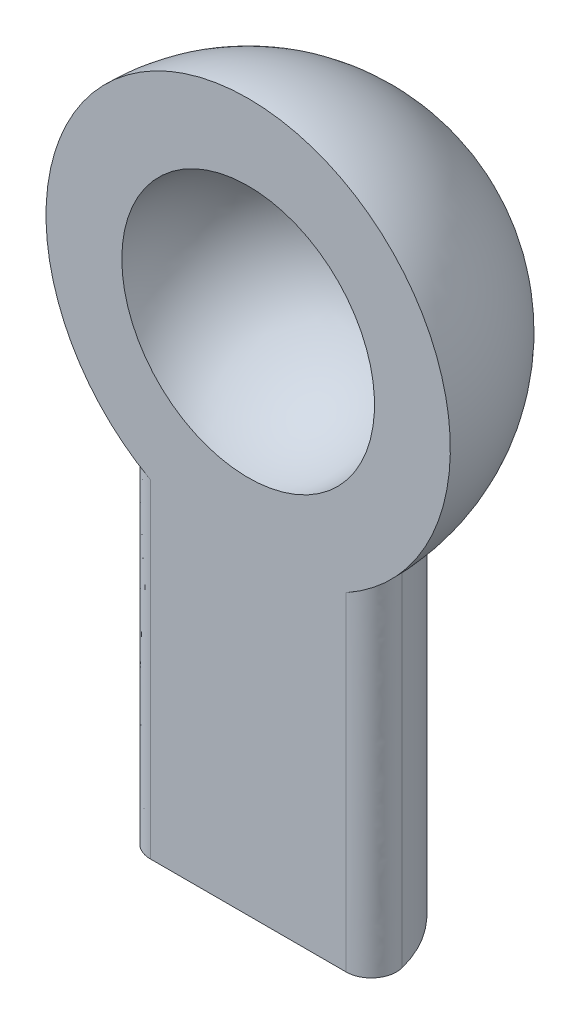
ISO-10303-21;
HEADER;
FILE_DESCRIPTION(('STEP AP214'),'2;1');
FILE_NAME('part.step','',(''),(''),'','','');
FILE_SCHEMA(('AUTOMOTIVE_DESIGN { 1 0 10303 214 1 1 1 1 }'));
ENDSEC;
DATA;
#1=APPLICATION_CONTEXT('core data for automotive mechanical design processes');
#2=APPLICATION_PROTOCOL_DEFINITION('international standard','automotive_design',2000,#1);
#3=PRODUCT_CONTEXT('',#1,'mechanical');
#4=PRODUCT('Part','Part','',(#3));
#5=PRODUCT_RELATED_PRODUCT_CATEGORY('part','',(#4));
#6=PRODUCT_DEFINITION_FORMATION('','',#4);
#7=PRODUCT_DEFINITION_CONTEXT('part definition',#1,'design');
#8=PRODUCT_DEFINITION('design','',#6,#7);
#9=PRODUCT_DEFINITION_SHAPE('','',#8);
#10=(LENGTH_UNIT() NAMED_UNIT(*) SI_UNIT(.MILLI.,.METRE.));
#11=(NAMED_UNIT(*) PLANE_ANGLE_UNIT() SI_UNIT($,.RADIAN.));
#12=(NAMED_UNIT(*) SI_UNIT($,.STERADIAN.) SOLID_ANGLE_UNIT());
#13=UNCERTAINTY_MEASURE_WITH_UNIT(LENGTH_MEASURE(1.E-05),#10,'distance_accuracy_value','');
#14=(GEOMETRIC_REPRESENTATION_CONTEXT(3) GLOBAL_UNCERTAINTY_ASSIGNED_CONTEXT((#13)) GLOBAL_UNIT_ASSIGNED_CONTEXT((#10,
#11,#12)) REPRESENTATION_CONTEXT('',''));
#15=CARTESIAN_POINT('',(0.,0.,0.));
#16=DIRECTION('',(0.,0.,1.));
#17=DIRECTION('',(1.,0.,0.));
#18=AXIS2_PLACEMENT_3D('',#15,#16,#17);
#19=CARTESIAN_POINT('',(0.,20.,0.));
#20=DIRECTION('',(0.,1.,0.));
#21=DIRECTION('',(-1.,0.,0.));
#22=AXIS2_PLACEMENT_3D('',#19,#20,#21);
#23=SPHERICAL_SURFACE('',#22,8.);
#24=CARTESIAN_POINT('',(0.,20.,0.));
#25=DIRECTION('',(0.,0.,-1.));
#26=DIRECTION('',(-1.,0.,0.));
#27=AXIS2_PLACEMENT_3D('',#24,#25,#26);
#28=CIRCLE('',#27,8.);
#29=CARTESIAN_POINT('',(-3.87298334620742,13.,0.));
#30=VERTEX_POINT('',#29);
#31=CARTESIAN_POINT('',(3.87298334620742,13.,0.));
#32=VERTEX_POINT('',#31);
#33=EDGE_CURVE('E103',#30,#32,#28,.T.);
#34=ORIENTED_EDGE('',*,*,#33,.T.);
#35=CARTESIAN_POINT('',(4.84122918275928,13.7550020016016,-1.24999999999997));
#36=CARTESIAN_POINT('',(4.84517449890082,13.7550017311124,-1.23472304321127));
#37=CARTESIAN_POINT('',(4.84875654363456,13.7547449194656,-1.21935310364537));
#38=CARTESIAN_POINT('',(4.85523204713585,13.7537310214066,-1.18826225589893));
#39=CARTESIAN_POINT('',(4.85811526435,13.7529670444844,-1.17253943677382));
#40=CARTESIAN_POINT('',(4.86315512987115,13.7509389497295,-1.14079000036561));
#41=CARTESIAN_POINT('',(4.86530136511618,13.7496681722117,-1.12476215928097));
#42=CARTESIAN_POINT('',(4.86883460976708,13.7466261548325,-1.0924542051));
#43=CARTESIAN_POINT('',(4.87021120919986,13.7448485221446,-1.07617355768935));
#44=CARTESIAN_POINT('',(4.87217688786771,13.7407925418353,-1.04341581706418));
#45=CARTESIAN_POINT('',(4.87275570488137,13.7385081004282,-1.02693886513861));
#46=CARTESIAN_POINT('',(4.87310297131638,13.7334381983167,-0.993847992774373));
#47=CARTESIAN_POINT('',(4.87286144508361,13.7306469635631,-0.977234854719974));
#48=CARTESIAN_POINT('',(4.87155107096679,13.7245631272731,-0.943934142065381));
#49=CARTESIAN_POINT('',(4.87047265526597,13.7212650836719,-0.927247940746631));
#50=CARTESIAN_POINT('',(4.86747791032664,13.7141673842342,-0.89386583201153));
#51=CARTESIAN_POINT('',(4.86555252307083,13.7103626247713,-0.877171824350381));
#52=CARTESIAN_POINT('',(4.8608600680814,13.7022507990612,-0.843840591073587));
#53=CARTESIAN_POINT('',(4.85808453347693,13.6979389617359,-0.827205722292755));
#54=CARTESIAN_POINT('',(4.85169461511282,13.6888139686373,-0.794058667739872));
#55=CARTESIAN_POINT('',(4.84807240927266,13.6839963843107,-0.777549206837306));
#56=CARTESIAN_POINT('',(4.8407653536439,13.6748156546857,-0.747833804420158));
#57=CARTESIAN_POINT('',(4.83721108705677,13.6705286271524,-0.734571917666171));
#58=CARTESIAN_POINT('',(4.82945406565619,13.6615165078695,-0.707828175143651));
#59=CARTESIAN_POINT('',(4.82523284555334,13.656781293593,-0.694355084642807));
#60=CARTESIAN_POINT('',(4.81610417482224,13.6468734353512,-0.667231607508277));
#61=CARTESIAN_POINT('',(4.81117819626278,13.6416913708853,-0.653590908815445));
#62=CARTESIAN_POINT('',(4.80060492791395,13.6308888259854,-0.6261804675787));
#63=CARTESIAN_POINT('',(4.79493919907934,13.6252595210524,-0.612421321630378));
#64=CARTESIAN_POINT('',(4.78285474235883,13.6135620263706,-0.584827688781449));
#65=CARTESIAN_POINT('',(4.77641781865232,13.6074855768217,-0.571004678888845));
#66=CARTESIAN_POINT('',(4.76276357004897,13.5948932304468,-0.543342303896936));
#67=CARTESIAN_POINT('',(4.75552845197282,13.5883695868553,-0.529515253887322));
#68=CARTESIAN_POINT('',(4.74025557326106,13.5748823990728,-0.501908726160739));
#69=CARTESIAN_POINT('',(4.73220058247628,13.5679115780576,-0.488142341728638));
#70=CARTESIAN_POINT('',(4.71527175236384,13.5535295054246,-0.460725534008017));
#71=CARTESIAN_POINT('',(4.70638140386347,13.5461114014188,-0.447088903544578));
#72=CARTESIAN_POINT('',(4.68777252438137,13.5308346921881,-0.420003766622003));
#73=CARTESIAN_POINT('',(4.67803835639875,13.5229696320898,-0.406569653127276));
#74=CARTESIAN_POINT('',(4.65774012447701,13.5067973465515,-0.379964795188951));
#75=CARTESIAN_POINT('',(4.64716143498882,13.4984839881344,-0.366808928255593));
#76=CARTESIAN_POINT('',(4.62793558529907,13.483558410808,-0.344092405931866));
#77=CARTESIAN_POINT('',(4.61940420748544,13.4769950113722,-0.334401150114037));
#78=CARTESIAN_POINT('',(4.60134917065085,13.4632469652882,-0.314671318671945));
#79=CARTESIAN_POINT('',(4.59179952039887,13.456053192288,-0.304662854347321));
#80=CARTESIAN_POINT('',(4.57165551558681,13.441042929965,-0.284405633045298));
#81=CARTESIAN_POINT('',(4.5610348536747,13.433218137639,-0.274189210649754));
#82=CARTESIAN_POINT('',(4.53870389739684,13.4169445811371,-0.25363481302909));
#83=CARTESIAN_POINT('',(4.5269674621031,13.4084880628905,-0.24333131088492));
#84=CARTESIAN_POINT('',(4.50878461697381,13.39552490143,-0.228104312534543));
#85=CARTESIAN_POINT('',(4.50248951042612,13.3910612451123,-0.222962113511322));
#86=CARTESIAN_POINT('',(4.48961373932205,13.3819746062639,-0.212702969386924));
#87=CARTESIAN_POINT('',(4.48303000780728,13.3773506529993,-0.207590731305967));
#88=CARTESIAN_POINT('',(4.46467665735069,13.3645389154318,-0.193703089960642));
#89=CARTESIAN_POINT('',(4.45278549817613,13.3563256086702,-0.185110961628013));
#90=CARTESIAN_POINT('',(4.42871773885719,13.3398747500577,-0.1685121798249));
#91=CARTESIAN_POINT('',(4.41654259280055,13.3316374559965,-0.160503158684071));
#92=CARTESIAN_POINT('',(4.39195120573381,13.3151314088798,-0.145083623340017));
#93=CARTESIAN_POINT('',(4.37953646662707,13.3068630165597,-0.1376703281985));
#94=CARTESIAN_POINT('',(4.35450407925143,13.2903015076084,-0.123447827579036));
#95=CARTESIAN_POINT('',(4.34188796004092,13.282008789911,-0.116635466439459));
#96=CARTESIAN_POINT('',(4.31650509682454,13.2653785656041,-0.10362350339597));
#97=CARTESIAN_POINT('',(4.30373977511997,13.2570416571234,-0.0974203582960616));
#98=CARTESIAN_POINT('',(4.27569767602682,13.2388644184053,-0.0845222273847646));
#99=CARTESIAN_POINT('',(4.26037539253841,13.2290185179265,-0.0779337564544241));
#100=CARTESIAN_POINT('',(4.22989139781612,13.2096887112524,-0.065720998394572));
#101=CARTESIAN_POINT('',(4.21474028849054,13.2002033198753,-0.0600725708280443));
#102=CARTESIAN_POINT('',(4.1846763776472,13.1815710679745,-0.0496884468560876));
#103=CARTESIAN_POINT('',(4.16977237755337,13.1724234283698,-0.0449286645399846));
#104=CARTESIAN_POINT('',(4.14025548531907,13.1544727561987,-0.0362604306973374));
#105=CARTESIAN_POINT('',(4.12565016383195,13.1456686739409,-0.0323283631249993));
#106=CARTESIAN_POINT('',(4.0967782990582,13.1284037050425,-0.0252544657546566));
#107=CARTESIAN_POINT('',(4.08251806777386,13.1199417029849,-0.0220895876168185));
#108=CARTESIAN_POINT('',(4.05437453211108,13.1033614467758,-0.016488168512126));
#109=CARTESIAN_POINT('',(4.04049643121136,13.0952419041192,-0.0140292873102553));
#110=CARTESIAN_POINT('',(4.01314770755768,13.0793466544179,-0.00977870084662752));
#111=CARTESIAN_POINT('',(3.99968129524523,13.0715694610967,-0.00796545352250233));
#112=CARTESIAN_POINT('',(3.97317926429902,13.0563592260841,-0.00494636358432231));
#113=CARTESIAN_POINT('',(3.96014699439738,13.0489244512521,-0.00371984389603224));
#114=CARTESIAN_POINT('',(3.93453026464198,13.0343991536632,-0.00181646041836933));
#115=CARTESIAN_POINT('',(3.92194841502806,13.0273066184958,-0.00111982607227008));
#116=CARTESIAN_POINT('',(3.89724355976341,13.0134667390964,-0.00022104334507246));
#117=CARTESIAN_POINT('',(3.88512256169745,13.0067170290987,-4.74547891261816E-08));
#118=CARTESIAN_POINT('',(3.87298334620742,13.,0.));
#119=B_SPLINE_CURVE_WITH_KNOTS('',3,(#35,#36,#37,#38,#39,#40,#41,#42,#43,#44,#45,#46,#47,#48,
#49,#50,#51,#52,#53,#54,#55,#56,#57,#58,#59,#60,#61,#62,#63,#64,#65,#66,#67,#68,#69,#70,#71,#72,
#73,#74,#75,#76,#77,#78,#79,#80,#81,#82,#83,#84,#85,#86,#87,#88,#89,#90,#91,#92,#93,#94,#95,#96,
#97,#98,#99,#100,#101,#102,#103,#104,#105,#106,#107,#108,#109,#110,#111,#112,#113,#114,#115,
#116,#117,#118),.UNSPECIFIED.,.F.,.F.,(4,2,2,2,2,2,2,2,2,2,2,2,2,2,2,2,2,2,2,2,2,2,2,2,2,2,2,2,
2,2,2,2,2,2,2,2,2,2,2,2,2,4),(0.,0.0473269009181145,0.0953103318650914,0.143946244780643,
0.193225000092512,0.243131913094547,0.293647873138192,0.344750026438545,0.396412512000527,
0.448607238804515,0.501304691052283,0.544441775659025,0.589101880513792,0.635288929018718,
0.683000169395728,0.732226182141734,0.782950910869669,0.835151731996871,0.888799578553837,
0.943859132535205,1.00028909865444,1.04373207280588,1.0904971184631,1.14054028938377,
1.19380330184971,1.22162144274668,1.25021568274399,1.3006417154031,1.35085002904772,
1.40080840201201,1.45048650557079,1.49985604473511,1.55794171589092,1.61416509373185,
1.66852089753118,1.7210107188144,1.77164225352661,1.82042855265082,1.86738730886469,
1.91254019257861,1.95591224694478,1.99753134825783),.UNSPECIFIED.);
#120=CARTESIAN_POINT('',(4.84122918275928,13.7550020016016,-1.24999999999997));
#121=VERTEX_POINT('',#120);
#122=EDGE_CURVE('E62',#32,#121,#119,.F.);
#123=ORIENTED_EDGE('',*,*,#122,.T.);
#124=CARTESIAN_POINT('',(0.,13.7550020016016,0.));
#125=DIRECTION('',(0.,1.,0.));
#126=DIRECTION('',(0.,0.,1.));
#127=AXIS2_PLACEMENT_3D('',#124,#125,#126);
#128=CIRCLE('',#127,5.);
#129=CARTESIAN_POINT('',(-4.84122918275926,13.7550020016016,-1.25000000000004));
#130=VERTEX_POINT('',#129);
#131=EDGE_CURVE('E108',#121,#130,#128,.T.);
#132=ORIENTED_EDGE('',*,*,#131,.T.);
#133=CARTESIAN_POINT('',(-3.87298334620742,13.,0.));
#134=CARTESIAN_POINT('',(-3.88426025106492,13.0062407262947,-1.67253781501792E-07));
#135=CARTESIAN_POINT('',(-3.89551492857825,13.0125212550388,-0.000190764600319241));
#136=CARTESIAN_POINT('',(-3.91866874949761,13.0255336229444,-0.000972840308844891));
#137=CARTESIAN_POINT('',(-3.93056486389096,13.0322694216143,-0.0015883006689479));
#138=CARTESIAN_POINT('',(-3.95500403247071,13.0461919526013,-0.00328971833224226));
#139=CARTESIAN_POINT('',(-3.96754356575377,13.0533817152868,-0.00440143880014567));
#140=CARTESIAN_POINT('',(-3.99326510692608,13.0682133095032,-0.0071711820111923));
#141=CARTESIAN_POINT('',(-4.00644280538155,13.0758574608212,-0.00885683260048889));
#142=CARTESIAN_POINT('',(-4.03342884211371,13.0915983597749,-0.0128559249651868));
#143=CARTESIAN_POINT('',(-4.04723182569824,13.0996967925027,-0.0151988915533788));
#144=CARTESIAN_POINT('',(-4.07544737079602,13.116346872749,-0.0205994272111727));
#145=CARTESIAN_POINT('',(-4.08985323784097,13.1248996830792,-0.0236884134854208));
#146=CARTESIAN_POINT('',(-4.11924284398668,13.142458752875,-0.0306724269198329));
#147=CARTESIAN_POINT('',(-4.13421825346362,13.151465736397,-0.0346007087299618));
#148=CARTESIAN_POINT('',(-4.16470227432436,13.1699342587246,-0.0433580209263774));
#149=CARTESIAN_POINT('',(-4.18020058885494,13.1793962301055,-0.0482220113965249));
#150=CARTESIAN_POINT('',(-4.21167345636195,13.1987718630582,-0.0589482863375153));
#151=CARTESIAN_POINT('',(-4.22763553672593,13.2086855747938,-0.0648470829404727));
#152=CARTESIAN_POINT('',(-4.25995558520474,13.2289772044854,-0.0777370174510141));
#153=CARTESIAN_POINT('',(-4.27629826989982,13.2393556158258,-0.0847657759737007));
#154=CARTESIAN_POINT('',(-4.3053210792898,13.2579676923677,-0.0981767922414438));
#155=CARTESIAN_POINT('',(-4.31807041418941,13.2662084838121,-0.104400030255777));
#156=CARTESIAN_POINT('',(-4.34341664614532,13.282694196337,-0.117448551813905));
#157=CARTESIAN_POINT('',(-4.35601168332097,13.2909386850377,-0.124277999823056));
#158=CARTESIAN_POINT('',(-4.38100172896137,13.3074434134765,-0.13853277320315));
#159=CARTESIAN_POINT('',(-4.39339477529436,13.3157033740108,-0.1459618611524));
#160=CARTESIAN_POINT('',(-4.41794344722145,13.332230501762,-0.16141192231368));
#161=CARTESIAN_POINT('',(-4.43009713149134,13.3404973978677,-0.169436270594179));
#162=CARTESIAN_POINT('',(-4.45411550068943,13.357060657571,-0.186058883020255));
#163=CARTESIAN_POINT('',(-4.46597823315958,13.3653569338471,-0.194660055578425));
#164=CARTESIAN_POINT('',(-4.48928944126313,13.3818120882725,-0.212358104706828));
#165=CARTESIAN_POINT('',(-4.50073985922088,13.3899714748086,-0.221451947157858));
#166=CARTESIAN_POINT('',(-4.52326398771482,13.4060971402199,-0.240165449138631));
#167=CARTESIAN_POINT('',(-4.53433877244625,13.4140639469734,-0.249783359844338));
#168=CARTESIAN_POINT('',(-4.55606667370814,13.4298267945053,-0.269512605102582));
#169=CARTESIAN_POINT('',(-4.56672123613319,13.4376233702882,-0.279621919925294));
#170=CARTESIAN_POINT('',(-4.58757940244896,13.4530372347649,-0.300309243214533));
#171=CARTESIAN_POINT('',(-4.59778481690463,13.4606551714496,-0.310884942562751));
#172=CARTESIAN_POINT('',(-4.61771035650425,13.4757230866386,-0.332469912936396));
#173=CARTESIAN_POINT('',(-4.62743272704942,13.4831737320333,-0.343476646501922));
#174=CARTESIAN_POINT('',(-4.64781117964939,13.4989823001072,-0.367602969700455));
#175=CARTESIAN_POINT('',(-4.6583982440965,13.5073151328685,-0.380797510932248));
#176=CARTESIAN_POINT('',(-4.67871247063192,13.5235162517942,-0.407484338758797));
#177=CARTESIAN_POINT('',(-4.68845426960998,13.531390904745,-0.420961618404674));
#178=CARTESIAN_POINT('',(-4.70707408662026,13.5466869315113,-0.448133214516413));
#179=CARTESIAN_POINT('',(-4.71596784587205,13.5541147502905,-0.461813110481881));
#180=CARTESIAN_POINT('',(-4.73290009080225,13.5685137323381,-0.489317236800921));
#181=CARTESIAN_POINT('',(-4.74095517380934,13.5754918087148,-0.503127624545902));
#182=CARTESIAN_POINT('',(-4.75622465632869,13.588991666637,-0.530822298390799));
#183=CARTESIAN_POINT('',(-4.76345638619381,13.5955207710958,-0.544693454235875));
#184=CARTESIAN_POINT('',(-4.77710044499716,13.6081220188642,-0.57244390138242));
#185=CARTESIAN_POINT('',(-4.78353067005881,13.6142019637082,-0.586310845040741));
#186=CARTESIAN_POINT('',(-4.79559844687034,13.625904470833,-0.613991869799861));
#187=CARTESIAN_POINT('',(-4.80125430080806,13.6315353502684,-0.627794448919459));
#188=CARTESIAN_POINT('',(-4.81180471979255,13.6423390467633,-0.65529100497607));
#189=CARTESIAN_POINT('',(-4.81671783158434,13.647520750181,-0.668974367701695));
#190=CARTESIAN_POINT('',(-4.82581787076638,13.657425900391,-0.696182168642175));
#191=CARTESIAN_POINT('',(-4.83002343380571,13.662158833113,-0.709696909487885));
#192=CARTESIAN_POINT('',(-4.83774647023027,13.6711643531311,-0.736522765110263));
#193=CARTESIAN_POINT('',(-4.84128251488277,13.6754471339095,-0.749825112609563));
#194=CARTESIAN_POINT('',(-4.84851793605977,13.684581222159,-0.77951689023877));
#195=CARTESIAN_POINT('',(-4.85209143072192,13.6893590914305,-0.795959884443312));
#196=CARTESIAN_POINT('',(-4.85839136995357,13.6984089340294,-0.82897147508804));
#197=CARTESIAN_POINT('',(-4.86112551326247,13.7026852684548,-0.845537408770571));
#198=CARTESIAN_POINT('',(-4.86574275920894,13.7107303206039,-0.878729097482264));
#199=CARTESIAN_POINT('',(-4.86763419311863,13.7145037367921,-0.895352551146842));
#200=CARTESIAN_POINT('',(-4.87056862288463,13.7215430014228,-0.928592740426213));
#201=CARTESIAN_POINT('',(-4.87162053008263,13.7248138750156,-0.945207623210851));
#202=CARTESIAN_POINT('',(-4.87288537972933,13.7308476251218,-0.978365727635962));
#203=CARTESIAN_POINT('',(-4.87310773409543,13.7336158594352,-0.99490761280711));
#204=CARTESIAN_POINT('',(-4.87272940919051,13.7386440214056,-1.02785681161495));
#205=CARTESIAN_POINT('',(-4.87213854279332,13.7409096330849,-1.04426336816708));
#206=CARTESIAN_POINT('',(-4.87015574456906,13.7449322201413,-1.0768819004704));
#207=CARTESIAN_POINT('',(-4.86877390809269,13.7466951937688,-1.09309374767369));
#208=CARTESIAN_POINT('',(-4.86523677356043,13.7497121653615,-1.12526636886301));
#209=CARTESIAN_POINT('',(-4.86309171769566,13.7509724555433,-1.14122767670434));
#210=CARTESIAN_POINT('',(-4.85806033221032,13.752983851423,-1.17284692098074));
#211=CARTESIAN_POINT('',(-4.8551842502252,13.753741511856,-1.18850606745252));
#212=CARTESIAN_POINT('',(-4.84872859465613,13.7547470631326,-1.21947297489699));
#213=CARTESIAN_POINT('',(-4.84515910345998,13.7550017360304,-1.23478262001604));
#214=CARTESIAN_POINT('',(-4.84122918275926,13.7550020016016,-1.25000000000004));
#215=B_SPLINE_CURVE_WITH_KNOTS('',3,(#133,#134,#135,#136,#137,#138,#139,#140,#141,#142,#143,
#144,#145,#146,#147,#148,#149,#150,#151,#152,#153,#154,#155,#156,#157,#158,#159,#160,#161,#162,
#163,#164,#165,#166,#167,#168,#169,#170,#171,#172,#173,#174,#175,#176,#177,#178,#179,#180,#181,
#182,#183,#184,#185,#186,#187,#188,#189,#190,#191,#192,#193,#194,#195,#196,#197,#198,#199,#200,
#201,#202,#203,#204,#205,#206,#207,#208,#209,#210,#211,#212,#213,#214),.UNSPECIFIED.,.F.,.F.,(4,
2,2,2,2,2,2,2,2,2,2,2,2,2,2,2,2,2,2,2,2,2,2,2,2,2,2,2,2,2,2,2,2,2,2,2,2,2,2,2,4),(0.,
0.0386640133752304,0.079710852891266,0.123194553822648,0.169167258103765,0.217678382625703,
0.268773585218735,0.322493525803233,0.37887242522525,0.437936432404873,0.499701821785661,
0.54891174621694,0.598490665857484,0.648409326763502,0.69863658005431,0.7491395260828,
0.799360641665544,0.849423365532818,0.899295335367933,0.948943301701567,0.998333379939762,
1.05488483450386,1.11006326394377,1.16382718682616,1.2161411323529,1.26697591878709,
1.31630884969266,1.3641238409308,1.41041149294053,1.45516912369352,1.4984007779017,
1.55084864885298,1.60279999666041,1.65422567803792,1.70509794689116,1.75539124406085,
1.80508295974744,1.85415415574929,1.90259023593983,1.95038155473196,1.99752395453478),.UNSPECIFIED.);
#216=EDGE_CURVE('E11',#130,#30,#215,.F.);
#217=ORIENTED_EDGE('',*,*,#216,.T.);
#218=EDGE_LOOP('',(#34,#123,#132,#217));
#219=FACE_BOUND('',#218,.T.);
#220=ADVANCED_FACE('F48',(#219),#23,.T.);
#221=CARTESIAN_POINT('',(0.,0.,0.));
#222=DIRECTION('',(0.,1.,0.));
#223=DIRECTION('',(0.,0.,1.));
#224=AXIS2_PLACEMENT_3D('',#221,#222,#223);
#225=CYLINDRICAL_SURFACE('',#224,5.);
#226=ORIENTED_EDGE('',*,*,#131,.F.);
#227=CARTESIAN_POINT('',(4.84122918275928,-0.687750100080081,-1.24999999999997));
#228=CARTESIAN_POINT('',(4.84122918275928,4.35575063384051,-1.24999999999997));
#229=CARTESIAN_POINT('',(4.84122918275928,9.39925136776109,-1.24999999999997));
#230=CARTESIAN_POINT('',(4.84122918275928,14.4427521016817,-1.24999999999997));
#231=(BOUNDED_CURVE() B_SPLINE_CURVE(3,(#227,#228,#229,#230),.UNSPECIFIED.,.F.,
.F.) B_SPLINE_CURVE_WITH_KNOTS((4,4),(-0.000687750100080081,0.0144427521016817),
.UNSPECIFIED.) CURVE() GEOMETRIC_REPRESENTATION_ITEM() RATIONAL_B_SPLINE_CURVE((1.,1.,1.,1.)) REPRESENTATION_ITEM(''));
#232=CARTESIAN_POINT('',(4.84122918275928,0.,-1.24999999999997));
#233=VERTEX_POINT('',#232);
#234=EDGE_CURVE('E126',#121,#233,#231,.F.);
#235=ORIENTED_EDGE('',*,*,#234,.T.);
#236=CARTESIAN_POINT('',(0.,0.,0.));
#237=DIRECTION('',(0.,1.,0.));
#238=DIRECTION('',(0.,0.,1.));
#239=AXIS2_PLACEMENT_3D('',#236,#237,#238);
#240=CIRCLE('',#239,5.);
#241=CARTESIAN_POINT('',(-4.84122918275926,0.,-1.25000000000004));
#242=VERTEX_POINT('',#241);
#243=EDGE_CURVE('E166',#233,#242,#240,.T.);
#244=ORIENTED_EDGE('',*,*,#243,.T.);
#245=CARTESIAN_POINT('',(-4.84122918275926,14.4427521016817,-1.25000000000004));
#246=CARTESIAN_POINT('',(-4.84122918275926,9.39925136776109,-1.25000000000004));
#247=CARTESIAN_POINT('',(-4.84122918275926,4.35575063384051,-1.25000000000004));
#248=CARTESIAN_POINT('',(-4.84122918275926,-0.687750100080081,-1.25000000000004));
#249=(BOUNDED_CURVE() B_SPLINE_CURVE(3,(#245,#246,#247,#248),.UNSPECIFIED.,.F.,
.F.) B_SPLINE_CURVE_WITH_KNOTS((4,4),(-0.000687750100080081,0.0144427521016817),
.UNSPECIFIED.) CURVE() GEOMETRIC_REPRESENTATION_ITEM() RATIONAL_B_SPLINE_CURVE((1.,1.,1.,1.)) REPRESENTATION_ITEM(''));
#250=EDGE_CURVE('E123',#242,#130,#249,.F.);
#251=ORIENTED_EDGE('',*,*,#250,.T.);
#252=EDGE_LOOP('',(#226,#235,#244,#251));
#253=FACE_BOUND('',#252,.T.);
#254=ADVANCED_FACE('F186',(#253),#225,.T.);
#255=CARTESIAN_POINT('',(0.,0.,0.));
#256=DIRECTION('',(0.,1.,0.));
#257=DIRECTION('',(0.,0.,1.));
#258=AXIS2_PLACEMENT_3D('',#255,#256,#257);
#259=PLANE('',#258);
#260=ORIENTED_EDGE('',*,*,#243,.F.);
#261=CARTESIAN_POINT('',(3.87298334620742,0.,0.));
#262=CARTESIAN_POINT('',(5.16397779494322,0.,0.));
#263=CARTESIAN_POINT('',(4.84122918275928,0.,-1.24999999999997));
#264=(BOUNDED_CURVE() B_SPLINE_CURVE(2,(#261,#262,#263),.UNSPECIFIED.,.F.,
.F.) B_SPLINE_CURVE_WITH_KNOTS((3,3),(0.,1.),
.UNSPECIFIED.) CURVE() GEOMETRIC_REPRESENTATION_ITEM() RATIONAL_B_SPLINE_CURVE((1.,
0.612372435695795,1.)) REPRESENTATION_ITEM(''));
#265=CARTESIAN_POINT('',(3.87298334620742,0.,0.));
#266=VERTEX_POINT('',#265);
#267=EDGE_CURVE('E118',#233,#266,#264,.F.);
#268=ORIENTED_EDGE('',*,*,#267,.T.);
#269=DIRECTION('',(1.,0.,0.));
#270=VECTOR('',#269,1.);
#271=CARTESIAN_POINT('',(0.,0.,0.));
#272=LINE('',#271,#270);
#273=CARTESIAN_POINT('',(-3.87298334620742,0.,0.));
#274=VERTEX_POINT('',#273);
#275=EDGE_CURVE('E101',#274,#266,#272,.T.);
#276=ORIENTED_EDGE('',*,*,#275,.F.);
#277=CARTESIAN_POINT('',(-4.84122918275926,0.,-1.25000000000004));
#278=CARTESIAN_POINT('',(-5.16397779494323,0.,0.));
#279=CARTESIAN_POINT('',(-3.87298334620742,0.,0.));
#280=(BOUNDED_CURVE() B_SPLINE_CURVE(2,(#277,#278,#279),.UNSPECIFIED.,.F.,
.F.) B_SPLINE_CURVE_WITH_KNOTS((3,3),(0.,1.),
.UNSPECIFIED.) CURVE() GEOMETRIC_REPRESENTATION_ITEM() RATIONAL_B_SPLINE_CURVE((1.,
0.612372435695794,1.)) REPRESENTATION_ITEM(''));
#281=EDGE_CURVE('E114',#274,#242,#280,.F.);
#282=ORIENTED_EDGE('',*,*,#281,.T.);
#283=EDGE_LOOP('',(#260,#268,#276,#282));
#284=FACE_BOUND('',#283,.T.);
#285=ADVANCED_FACE('F113',(#284),#259,.F.);
#286=CARTESIAN_POINT('',(0.,20.,0.));
#287=DIRECTION('',(0.,1.,0.));
#288=DIRECTION('',(-1.,0.,0.));
#289=AXIS2_PLACEMENT_3D('',#286,#287,#288);
#290=SPHERICAL_SURFACE('',#289,5.);
#291=CARTESIAN_POINT('',(0.,20.,0.));
#292=DIRECTION('',(0.,0.,-1.));
#293=DIRECTION('',(-1.,0.,0.));
#294=AXIS2_PLACEMENT_3D('',#291,#292,#293);
#295=SPHERICAL_SURFACE('',#294,5.);
#296=CARTESIAN_POINT('',(0.,20.,0.));
#297=DIRECTION('',(0.,0.,-1.));
#298=DIRECTION('',(-1.,0.,0.));
#299=AXIS2_PLACEMENT_3D('',#296,#297,#298);
#300=CIRCLE('',#299,5.);
#301=CARTESIAN_POINT('',(-5.,20.,0.));
#302=VERTEX_POINT('',#301);
#303=EDGE_CURVE('E121',#302,#302,#300,.T.);
#304=ORIENTED_EDGE('',*,*,#303,.F.);
#305=EDGE_LOOP('',(#304));
#306=FACE_BOUND('',#305,.T.);
#307=ADVANCED_FACE('F177',(#306),#295,.F.);
#308=CARTESIAN_POINT('',(0.,0.,0.));
#309=DIRECTION('',(0.,0.,-1.));
#310=DIRECTION('',(-1.,0.,0.));
#311=AXIS2_PLACEMENT_3D('',#308,#309,#310);
#312=PLANE('',#311);
#313=ORIENTED_EDGE('',*,*,#303,.T.);
#314=EDGE_LOOP('',(#313));
#315=FACE_BOUND('',#314,.T.);
#316=ORIENTED_EDGE('',*,*,#275,.T.);
#317=CARTESIAN_POINT('',(3.87298334620742,14.4427521016817,0.));
#318=CARTESIAN_POINT('',(3.87298334620742,9.39925136776109,0.));
#319=CARTESIAN_POINT('',(3.87298334620742,4.35575063384051,0.));
#320=CARTESIAN_POINT('',(3.87298334620742,-0.687750100080081,0.));
#321=(BOUNDED_CURVE() B_SPLINE_CURVE(3,(#317,#318,#319,#320),.UNSPECIFIED.,.F.,
.F.) B_SPLINE_CURVE_WITH_KNOTS((4,4),(-0.000687750100080081,0.0144427521016817),
.UNSPECIFIED.) CURVE() GEOMETRIC_REPRESENTATION_ITEM() RATIONAL_B_SPLINE_CURVE((1.,1.,1.,1.)) REPRESENTATION_ITEM(''));
#322=EDGE_CURVE('E107',#266,#32,#321,.F.);
#323=ORIENTED_EDGE('',*,*,#322,.T.);
#324=ORIENTED_EDGE('',*,*,#33,.F.);
#325=CARTESIAN_POINT('',(-3.87298334620742,-0.687750100080081,0.));
#326=CARTESIAN_POINT('',(-3.87298334620742,4.35575063384051,0.));
#327=CARTESIAN_POINT('',(-3.87298334620742,9.39925136776109,0.));
#328=CARTESIAN_POINT('',(-3.87298334620742,14.4427521016817,0.));
#329=(BOUNDED_CURVE() B_SPLINE_CURVE(3,(#325,#326,#327,#328),.UNSPECIFIED.,.F.,
.F.) B_SPLINE_CURVE_WITH_KNOTS((4,4),(-0.000687750100080081,0.0144427521016817),
.UNSPECIFIED.) CURVE() GEOMETRIC_REPRESENTATION_ITEM() RATIONAL_B_SPLINE_CURVE((1.,1.,1.,1.)) REPRESENTATION_ITEM(''));
#330=EDGE_CURVE('E96',#30,#274,#329,.F.);
#331=ORIENTED_EDGE('',*,*,#330,.T.);
#332=EDGE_LOOP('',(#316,#323,#324,#331));
#333=FACE_BOUND('',#332,.T.);
#334=ADVANCED_FACE('F99',(#315,#333),#312,.F.);
#335=CARTESIAN_POINT('',(3.87298334620742,-0.687750100080081,0.));
#336=CARTESIAN_POINT('',(3.87298334620742,4.35575063384051,0.));
#337=CARTESIAN_POINT('',(3.87298334620742,9.39925136776109,0.));
#338=CARTESIAN_POINT('',(3.87298334620742,14.4427521016817,0.));
#339=CARTESIAN_POINT('',(5.16397779494322,-0.687750100080081,0.));
#340=CARTESIAN_POINT('',(5.16397779494322,4.35575063384051,0.));
#341=CARTESIAN_POINT('',(5.16397779494322,9.39925136776109,0.));
#342=CARTESIAN_POINT('',(5.16397779494322,14.4427521016817,0.));
#343=CARTESIAN_POINT('',(4.84122918275928,-0.687750100080081,-1.24999999999997));
#344=CARTESIAN_POINT('',(4.84122918275928,4.35575063384051,-1.24999999999997));
#345=CARTESIAN_POINT('',(4.84122918275928,9.39925136776109,-1.24999999999997));
#346=CARTESIAN_POINT('',(4.84122918275928,14.4427521016817,-1.24999999999997));
#347=(BOUNDED_SURFACE() B_SPLINE_SURFACE(2,3,((#335,#336,#337,#338),(#339,#340,#341,#342),(#343,
#344,#345,#346)),.UNSPECIFIED.,.F.,.F.,.F.) B_SPLINE_SURFACE_WITH_KNOTS((3,3),(4,4),(0.,1.),
(-0.000687750100080081,0.0144427521016817),
.UNSPECIFIED.) GEOMETRIC_REPRESENTATION_ITEM() RATIONAL_B_SPLINE_SURFACE(((1.,1.,1.,1.),
(0.612372435695794,0.612372435695794,0.612372435695794,0.612372435695794),(1.,1.,1.,1.))) REPRESENTATION_ITEM('') SURFACE());
#348=ORIENTED_EDGE('',*,*,#267,.F.);
#349=ORIENTED_EDGE('',*,*,#234,.F.);
#350=ORIENTED_EDGE('',*,*,#122,.F.);
#351=ORIENTED_EDGE('',*,*,#322,.F.);
#352=EDGE_LOOP('',(#348,#349,#350,#351));
#353=FACE_BOUND('',#352,.T.);
#354=ADVANCED_FACE('F151',(#353),#347,.T.);
#355=CARTESIAN_POINT('',(-4.84122918275926,-0.687750100080081,-1.25000000000004));
#356=CARTESIAN_POINT('',(-4.84122918275926,4.35575063384051,-1.25000000000004));
#357=CARTESIAN_POINT('',(-4.84122918275926,9.39925136776109,-1.25000000000004));
#358=CARTESIAN_POINT('',(-4.84122918275926,14.4427521016817,-1.25000000000004));
#359=CARTESIAN_POINT('',(-5.16397779494323,-0.687750100080081,0.));
#360=CARTESIAN_POINT('',(-5.16397779494323,4.35575063384051,0.));
#361=CARTESIAN_POINT('',(-5.16397779494323,9.39925136776109,0.));
#362=CARTESIAN_POINT('',(-5.16397779494323,14.4427521016817,0.));
#363=CARTESIAN_POINT('',(-3.87298334620742,-0.687750100080081,0.));
#364=CARTESIAN_POINT('',(-3.87298334620742,4.35575063384051,0.));
#365=CARTESIAN_POINT('',(-3.87298334620742,9.39925136776109,0.));
#366=CARTESIAN_POINT('',(-3.87298334620742,14.4427521016817,0.));
#367=(BOUNDED_SURFACE() B_SPLINE_SURFACE(2,3,((#355,#356,#357,#358),(#359,#360,#361,#362),(#363,
#364,#365,#366)),.UNSPECIFIED.,.F.,.F.,.F.) B_SPLINE_SURFACE_WITH_KNOTS((3,3),(4,4),(0.,1.),
(-0.000687750100080081,0.0144427521016817),
.UNSPECIFIED.) GEOMETRIC_REPRESENTATION_ITEM() RATIONAL_B_SPLINE_SURFACE(((1.,1.,1.,1.),
(0.612372435695794,0.612372435695794,0.612372435695794,0.612372435695794),(1.,1.,1.,1.))) REPRESENTATION_ITEM('') SURFACE());
#368=ORIENTED_EDGE('',*,*,#281,.F.);
#369=ORIENTED_EDGE('',*,*,#330,.F.);
#370=ORIENTED_EDGE('',*,*,#216,.F.);
#371=ORIENTED_EDGE('',*,*,#250,.F.);
#372=EDGE_LOOP('',(#368,#369,#370,#371));
#373=FACE_BOUND('',#372,.T.);
#374=ADVANCED_FACE('F51',(#373),#367,.T.);
#375=CLOSED_SHELL('',(#220,#254,#285,#307,#334,#354,#374));
#376=MANIFOLD_SOLID_BREP('B2',#375);
#377=ADVANCED_BREP_SHAPE_REPRESENTATION('',(#18,#376),#14);
#378=SHAPE_DEFINITION_REPRESENTATION(#9,#377);
ENDSEC;
END-ISO-10303-21;
